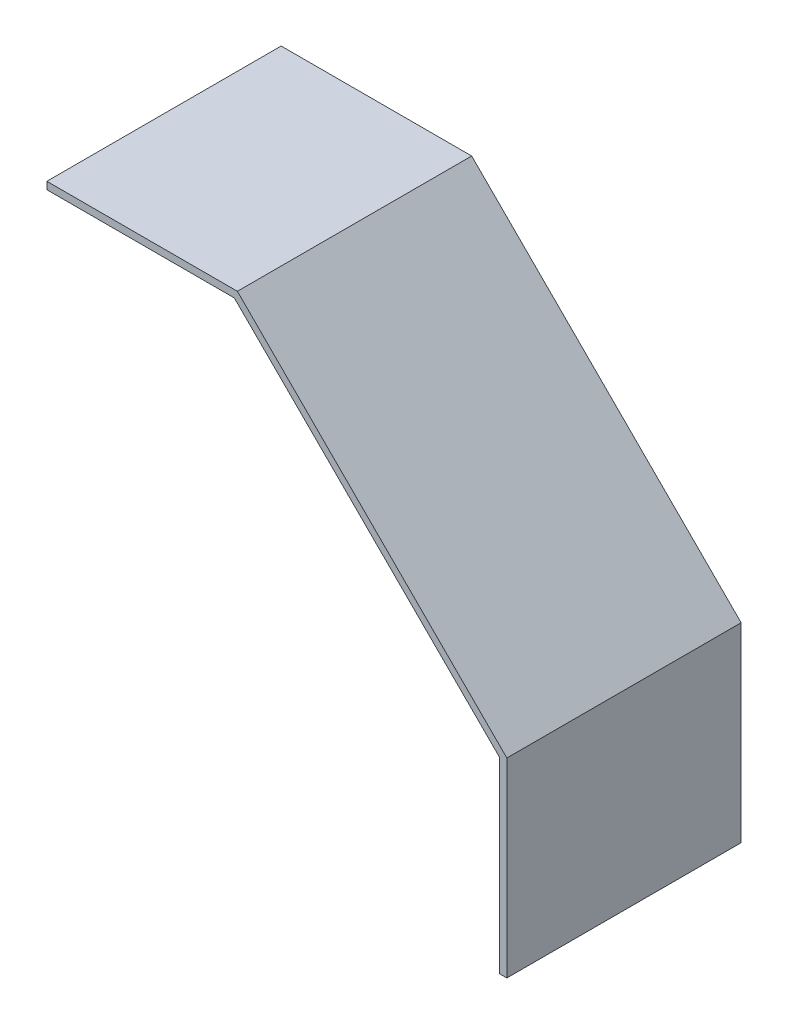
ISO-10303-21;
HEADER;
FILE_DESCRIPTION(('STEP AP214'),'2;1');
FILE_NAME('part.step','',(''),(''),'','','');
FILE_SCHEMA(('AUTOMOTIVE_DESIGN { 1 0 10303 214 1 1 1 1 }'));
ENDSEC;
DATA;
#1=APPLICATION_CONTEXT('core data for automotive mechanical design processes');
#2=APPLICATION_PROTOCOL_DEFINITION('international standard','automotive_design',2000,#1);
#3=PRODUCT_CONTEXT('',#1,'mechanical');
#4=PRODUCT('Part','Part','',(#3));
#5=PRODUCT_RELATED_PRODUCT_CATEGORY('part','',(#4));
#6=PRODUCT_DEFINITION_FORMATION('','',#4);
#7=PRODUCT_DEFINITION_CONTEXT('part definition',#1,'design');
#8=PRODUCT_DEFINITION('design','',#6,#7);
#9=PRODUCT_DEFINITION_SHAPE('','',#8);
#10=(LENGTH_UNIT() NAMED_UNIT(*) SI_UNIT(.MILLI.,.METRE.));
#11=(NAMED_UNIT(*) PLANE_ANGLE_UNIT() SI_UNIT($,.RADIAN.));
#12=(NAMED_UNIT(*) SI_UNIT($,.STERADIAN.) SOLID_ANGLE_UNIT());
#13=UNCERTAINTY_MEASURE_WITH_UNIT(LENGTH_MEASURE(1.E-05),#10,'distance_accuracy_value','');
#14=(GEOMETRIC_REPRESENTATION_CONTEXT(3) GLOBAL_UNCERTAINTY_ASSIGNED_CONTEXT((#13)) GLOBAL_UNIT_ASSIGNED_CONTEXT((#10,
#11,#12)) REPRESENTATION_CONTEXT('',''));
#15=CARTESIAN_POINT('',(0.,0.,0.));
#16=DIRECTION('',(0.,0.,1.));
#17=DIRECTION('',(1.,0.,0.));
#18=AXIS2_PLACEMENT_3D('',#15,#16,#17);
#19=CARTESIAN_POINT('',(165.242706095246,398.931182138374,203.2));
#20=DIRECTION('',(-0.707106781186548,-0.707106781186547,0.));
#21=DIRECTION('',(0.707106781186547,-0.707106781186548,0.));
#22=AXIS2_PLACEMENT_3D('',#19,#20,#21);
#23=PLANE('',#22);
#24=DIRECTION('',(-0.707106781186547,0.707106781186548,0.));
#25=VECTOR('',#24,1.);
#26=CARTESIAN_POINT('',(165.242706095246,398.931182138374,0.));
#27=LINE('',#26,#25);
#28=CARTESIAN_POINT('',(398.931182138374,165.242706095246,0.));
#29=VERTEX_POINT('',#28);
#30=CARTESIAN_POINT('',(165.242706095246,398.931182138374,0.));
#31=VERTEX_POINT('',#30);
#32=EDGE_CURVE('E132',#29,#31,#27,.T.);
#33=ORIENTED_EDGE('',*,*,#32,.T.);
#34=DIRECTION('',(0.,0.,-1.));
#35=VECTOR('',#34,1.);
#36=CARTESIAN_POINT('',(165.242706095246,398.931182138374,203.2));
#37=LINE('',#36,#35);
#38=CARTESIAN_POINT('',(165.242706095246,398.931182138374,203.2));
#39=VERTEX_POINT('',#38);
#40=EDGE_CURVE('E11',#39,#31,#37,.T.);
#41=ORIENTED_EDGE('',*,*,#40,.F.);
#42=DIRECTION('',(-0.707106781186547,0.707106781186548,0.));
#43=VECTOR('',#42,1.);
#44=CARTESIAN_POINT('',(165.242706095246,398.931182138374,203.2));
#45=LINE('',#44,#43);
#46=CARTESIAN_POINT('',(398.931182138374,165.242706095246,203.2));
#47=VERTEX_POINT('',#46);
#48=EDGE_CURVE('E146',#47,#39,#45,.T.);
#49=ORIENTED_EDGE('',*,*,#48,.F.);
#50=DIRECTION('',(0.,0.,-1.));
#51=VECTOR('',#50,1.);
#52=CARTESIAN_POINT('',(398.931182138374,165.242706095246,203.2));
#53=LINE('',#52,#51);
#54=EDGE_CURVE('E128',#47,#29,#53,.T.);
#55=ORIENTED_EDGE('',*,*,#54,.T.);
#56=EDGE_LOOP('',(#33,#41,#49,#55));
#57=FACE_BOUND('',#56,.T.);
#58=ADVANCED_FACE('F36',(#57),#23,.F.);
#59=CARTESIAN_POINT('',(0.,398.931182138373,203.2));
#60=DIRECTION('',(0.,-1.,0.));
#61=DIRECTION('',(1.,0.,0.));
#62=AXIS2_PLACEMENT_3D('',#59,#60,#61);
#63=PLANE('',#62);
#64=DIRECTION('',(-1.,0.,0.));
#65=VECTOR('',#64,1.);
#66=CARTESIAN_POINT('',(0.,398.931182138373,0.));
#67=LINE('',#66,#65);
#68=CARTESIAN_POINT('',(0.,398.931182138373,0.));
#69=VERTEX_POINT('',#68);
#70=EDGE_CURVE('E135',#31,#69,#67,.T.);
#71=ORIENTED_EDGE('',*,*,#70,.T.);
#72=DIRECTION('',(0.,0.,-1.));
#73=VECTOR('',#72,1.);
#74=CARTESIAN_POINT('',(0.,398.931182138373,203.2));
#75=LINE('',#74,#73);
#76=CARTESIAN_POINT('',(0.,398.931182138373,203.2));
#77=VERTEX_POINT('',#76);
#78=EDGE_CURVE('E44',#77,#69,#75,.T.);
#79=ORIENTED_EDGE('',*,*,#78,.F.);
#80=DIRECTION('',(-1.,0.,0.));
#81=VECTOR('',#80,1.);
#82=CARTESIAN_POINT('',(0.,398.931182138373,203.2));
#83=LINE('',#82,#81);
#84=EDGE_CURVE('E95',#39,#77,#83,.T.);
#85=ORIENTED_EDGE('',*,*,#84,.F.);
#86=ORIENTED_EDGE('',*,*,#40,.T.);
#87=EDGE_LOOP('',(#71,#79,#85,#86));
#88=FACE_BOUND('',#87,.T.);
#89=ADVANCED_FACE('F181',(#88),#63,.F.);
#90=CARTESIAN_POINT('',(0.,398.931182138373,203.2));
#91=DIRECTION('',(1.,0.,0.));
#92=DIRECTION('',(0.,1.,0.));
#93=AXIS2_PLACEMENT_3D('',#90,#91,#92);
#94=PLANE('',#93);
#95=DIRECTION('',(0.,-1.,0.));
#96=VECTOR('',#95,1.);
#97=CARTESIAN_POINT('',(0.,398.931182138373,0.));
#98=LINE('',#97,#96);
#99=CARTESIAN_POINT('',(0.,392.581182138373,0.));
#100=VERTEX_POINT('',#99);
#101=EDGE_CURVE('E137',#69,#100,#98,.T.);
#102=ORIENTED_EDGE('',*,*,#101,.T.);
#103=DIRECTION('',(0.,0.,-1.));
#104=VECTOR('',#103,1.);
#105=CARTESIAN_POINT('',(0.,392.581182138373,203.2));
#106=LINE('',#105,#104);
#107=CARTESIAN_POINT('',(0.,392.581182138373,203.2));
#108=VERTEX_POINT('',#107);
#109=EDGE_CURVE('E153',#108,#100,#106,.T.);
#110=ORIENTED_EDGE('',*,*,#109,.F.);
#111=DIRECTION('',(0.,-1.,0.));
#112=VECTOR('',#111,1.);
#113=CARTESIAN_POINT('',(0.,398.931182138373,203.2));
#114=LINE('',#113,#112);
#115=EDGE_CURVE('E161',#77,#108,#114,.T.);
#116=ORIENTED_EDGE('',*,*,#115,.F.);
#117=ORIENTED_EDGE('',*,*,#78,.T.);
#118=EDGE_LOOP('',(#102,#110,#116,#117));
#119=FACE_BOUND('',#118,.T.);
#120=ADVANCED_FACE('F159',(#119),#94,.F.);
#121=CARTESIAN_POINT('',(0.,392.581182138373,203.2));
#122=DIRECTION('',(0.,1.,0.));
#123=DIRECTION('',(0.,0.,1.));
#124=AXIS2_PLACEMENT_3D('',#121,#122,#123);
#125=PLANE('',#124);
#126=DIRECTION('',(1.,0.,0.));
#127=VECTOR('',#126,1.);
#128=CARTESIAN_POINT('',(0.,392.581182138373,0.));
#129=LINE('',#128,#127);
#130=CARTESIAN_POINT('',(162.612449974177,392.581182138373,0.));
#131=VERTEX_POINT('',#130);
#132=EDGE_CURVE('E139',#100,#131,#129,.T.);
#133=ORIENTED_EDGE('',*,*,#132,.T.);
#134=DIRECTION('',(0.,0.,-1.));
#135=VECTOR('',#134,1.);
#136=CARTESIAN_POINT('',(162.612449974177,392.581182138373,203.2));
#137=LINE('',#136,#135);
#138=CARTESIAN_POINT('',(162.612449974177,392.581182138373,203.2));
#139=VERTEX_POINT('',#138);
#140=EDGE_CURVE('E150',#139,#131,#137,.T.);
#141=ORIENTED_EDGE('',*,*,#140,.F.);
#142=DIRECTION('',(1.,0.,0.));
#143=VECTOR('',#142,1.);
#144=CARTESIAN_POINT('',(0.,392.581182138373,203.2));
#145=LINE('',#144,#143);
#146=EDGE_CURVE('E173',#108,#139,#145,.T.);
#147=ORIENTED_EDGE('',*,*,#146,.F.);
#148=ORIENTED_EDGE('',*,*,#109,.T.);
#149=EDGE_LOOP('',(#133,#141,#147,#148));
#150=FACE_BOUND('',#149,.T.);
#151=ADVANCED_FACE('F169',(#150),#125,.F.);
#152=CARTESIAN_POINT('',(162.612449974177,392.581182138373,203.2));
#153=DIRECTION('',(0.707106781186548,0.707106781186547,0.));
#154=DIRECTION('',(-0.707106781186547,0.707106781186548,0.));
#155=AXIS2_PLACEMENT_3D('',#152,#153,#154);
#156=PLANE('',#155);
#157=DIRECTION('',(0.707106781186547,-0.707106781186548,0.));
#158=VECTOR('',#157,1.);
#159=CARTESIAN_POINT('',(162.612449974177,392.581182138373,0.));
#160=LINE('',#159,#158);
#161=CARTESIAN_POINT('',(392.581182138374,162.612449974176,0.));
#162=VERTEX_POINT('',#161);
#163=EDGE_CURVE('E141',#131,#162,#160,.T.);
#164=ORIENTED_EDGE('',*,*,#163,.T.);
#165=DIRECTION('',(0.,0.,-1.));
#166=VECTOR('',#165,1.);
#167=CARTESIAN_POINT('',(392.581182138374,162.612449974176,203.2));
#168=LINE('',#167,#166);
#169=CARTESIAN_POINT('',(392.581182138374,162.612449974176,203.2));
#170=VERTEX_POINT('',#169);
#171=EDGE_CURVE('E123',#170,#162,#168,.T.);
#172=ORIENTED_EDGE('',*,*,#171,.F.);
#173=DIRECTION('',(0.707106781186547,-0.707106781186548,0.));
#174=VECTOR('',#173,1.);
#175=CARTESIAN_POINT('',(162.612449974177,392.581182138373,203.2));
#176=LINE('',#175,#174);
#177=EDGE_CURVE('E114',#139,#170,#176,.T.);
#178=ORIENTED_EDGE('',*,*,#177,.F.);
#179=ORIENTED_EDGE('',*,*,#140,.T.);
#180=EDGE_LOOP('',(#164,#172,#178,#179));
#181=FACE_BOUND('',#180,.T.);
#182=ADVANCED_FACE('F172',(#181),#156,.F.);
#183=CARTESIAN_POINT('',(392.581182138374,162.612449974176,203.2));
#184=DIRECTION('',(1.,0.,0.));
#185=DIRECTION('',(0.,0.,-1.));
#186=AXIS2_PLACEMENT_3D('',#183,#184,#185);
#187=PLANE('',#186);
#188=DIRECTION('',(0.,-1.,0.));
#189=VECTOR('',#188,1.);
#190=CARTESIAN_POINT('',(392.581182138374,162.612449974176,0.));
#191=LINE('',#190,#189);
#192=CARTESIAN_POINT('',(392.581182138374,0.,0.));
#193=VERTEX_POINT('',#192);
#194=EDGE_CURVE('E122',#162,#193,#191,.T.);
#195=ORIENTED_EDGE('',*,*,#194,.T.);
#196=DIRECTION('',(0.,0.,-1.));
#197=VECTOR('',#196,1.);
#198=CARTESIAN_POINT('',(392.581182138374,0.,203.2));
#199=LINE('',#198,#197);
#200=CARTESIAN_POINT('',(392.581182138374,0.,203.2));
#201=VERTEX_POINT('',#200);
#202=EDGE_CURVE('E119',#201,#193,#199,.T.);
#203=ORIENTED_EDGE('',*,*,#202,.F.);
#204=DIRECTION('',(0.,-1.,0.));
#205=VECTOR('',#204,1.);
#206=CARTESIAN_POINT('',(392.581182138374,162.612449974176,203.2));
#207=LINE('',#206,#205);
#208=EDGE_CURVE('E108',#170,#201,#207,.T.);
#209=ORIENTED_EDGE('',*,*,#208,.F.);
#210=ORIENTED_EDGE('',*,*,#171,.T.);
#211=EDGE_LOOP('',(#195,#203,#209,#210));
#212=FACE_BOUND('',#211,.T.);
#213=ADVANCED_FACE('F120',(#212),#187,.F.);
#214=CARTESIAN_POINT('',(398.931182138374,0.,203.2));
#215=DIRECTION('',(0.,1.,0.));
#216=DIRECTION('',(-1.,0.,0.));
#217=AXIS2_PLACEMENT_3D('',#214,#215,#216);
#218=PLANE('',#217);
#219=DIRECTION('',(1.,0.,0.));
#220=VECTOR('',#219,1.);
#221=CARTESIAN_POINT('',(398.931182138374,0.,0.));
#222=LINE('',#221,#220);
#223=CARTESIAN_POINT('',(398.931182138374,0.,0.));
#224=VERTEX_POINT('',#223);
#225=EDGE_CURVE('E81',#193,#224,#222,.T.);
#226=ORIENTED_EDGE('',*,*,#225,.T.);
#227=DIRECTION('',(0.,0.,-1.));
#228=VECTOR('',#227,1.);
#229=CARTESIAN_POINT('',(398.931182138374,0.,203.2));
#230=LINE('',#229,#228);
#231=CARTESIAN_POINT('',(398.931182138374,0.,203.2));
#232=VERTEX_POINT('',#231);
#233=EDGE_CURVE('E124',#232,#224,#230,.T.);
#234=ORIENTED_EDGE('',*,*,#233,.F.);
#235=DIRECTION('',(1.,0.,0.));
#236=VECTOR('',#235,1.);
#237=CARTESIAN_POINT('',(398.931182138374,0.,203.2));
#238=LINE('',#237,#236);
#239=EDGE_CURVE('E112',#201,#232,#238,.T.);
#240=ORIENTED_EDGE('',*,*,#239,.F.);
#241=ORIENTED_EDGE('',*,*,#202,.T.);
#242=EDGE_LOOP('',(#226,#234,#240,#241));
#243=FACE_BOUND('',#242,.T.);
#244=ADVANCED_FACE('F126',(#243),#218,.F.);
#245=CARTESIAN_POINT('',(398.931182138374,165.242706095246,203.2));
#246=DIRECTION('',(-1.,0.,0.));
#247=DIRECTION('',(0.,-1.,0.));
#248=AXIS2_PLACEMENT_3D('',#245,#246,#247);
#249=PLANE('',#248);
#250=DIRECTION('',(0.,1.,0.));
#251=VECTOR('',#250,1.);
#252=CARTESIAN_POINT('',(398.931182138374,165.242706095246,0.));
#253=LINE('',#252,#251);
#254=EDGE_CURVE('E87',#224,#29,#253,.T.);
#255=ORIENTED_EDGE('',*,*,#254,.T.);
#256=ORIENTED_EDGE('',*,*,#54,.F.);
#257=DIRECTION('',(0.,1.,0.));
#258=VECTOR('',#257,1.);
#259=CARTESIAN_POINT('',(398.931182138374,165.242706095246,203.2));
#260=LINE('',#259,#258);
#261=EDGE_CURVE('E52',#232,#47,#260,.T.);
#262=ORIENTED_EDGE('',*,*,#261,.F.);
#263=ORIENTED_EDGE('',*,*,#233,.T.);
#264=EDGE_LOOP('',(#255,#256,#262,#263));
#265=FACE_BOUND('',#264,.T.);
#266=ADVANCED_FACE('F197',(#265),#249,.F.);
#267=CARTESIAN_POINT('',(0.,0.,203.2));
#268=DIRECTION('',(0.,0.,-1.));
#269=DIRECTION('',(-1.,0.,0.));
#270=AXIS2_PLACEMENT_3D('',#267,#268,#269);
#271=PLANE('',#270);
#272=ORIENTED_EDGE('',*,*,#48,.T.);
#273=ORIENTED_EDGE('',*,*,#84,.T.);
#274=ORIENTED_EDGE('',*,*,#115,.T.);
#275=ORIENTED_EDGE('',*,*,#146,.T.);
#276=ORIENTED_EDGE('',*,*,#177,.T.);
#277=ORIENTED_EDGE('',*,*,#208,.T.);
#278=ORIENTED_EDGE('',*,*,#239,.T.);
#279=ORIENTED_EDGE('',*,*,#261,.T.);
#280=EDGE_LOOP('',(#272,#273,#274,#275,#276,#277,#278,#279));
#281=FACE_BOUND('',#280,.T.);
#282=ADVANCED_FACE('F110',(#281),#271,.F.);
#283=CARTESIAN_POINT('',(0.,0.,0.));
#284=DIRECTION('',(0.,0.,-1.));
#285=DIRECTION('',(-1.,0.,0.));
#286=AXIS2_PLACEMENT_3D('',#283,#284,#285);
#287=PLANE('',#286);
#288=ORIENTED_EDGE('',*,*,#32,.F.);
#289=ORIENTED_EDGE('',*,*,#254,.F.);
#290=ORIENTED_EDGE('',*,*,#225,.F.);
#291=ORIENTED_EDGE('',*,*,#194,.F.);
#292=ORIENTED_EDGE('',*,*,#163,.F.);
#293=ORIENTED_EDGE('',*,*,#132,.F.);
#294=ORIENTED_EDGE('',*,*,#101,.F.);
#295=ORIENTED_EDGE('',*,*,#70,.F.);
#296=EDGE_LOOP('',(#288,#289,#290,#291,#292,#293,#294,#295));
#297=FACE_BOUND('',#296,.T.);
#298=ADVANCED_FACE('F165',(#297),#287,.T.);
#299=CLOSED_SHELL('',(#58,#89,#120,#151,#182,#213,#244,#266,#282,#298));
#300=MANIFOLD_SOLID_BREP('B2',#299);
#301=ADVANCED_BREP_SHAPE_REPRESENTATION('',(#18,#300),#14);
#302=SHAPE_DEFINITION_REPRESENTATION(#9,#301);
ENDSEC;
END-ISO-10303-21;
